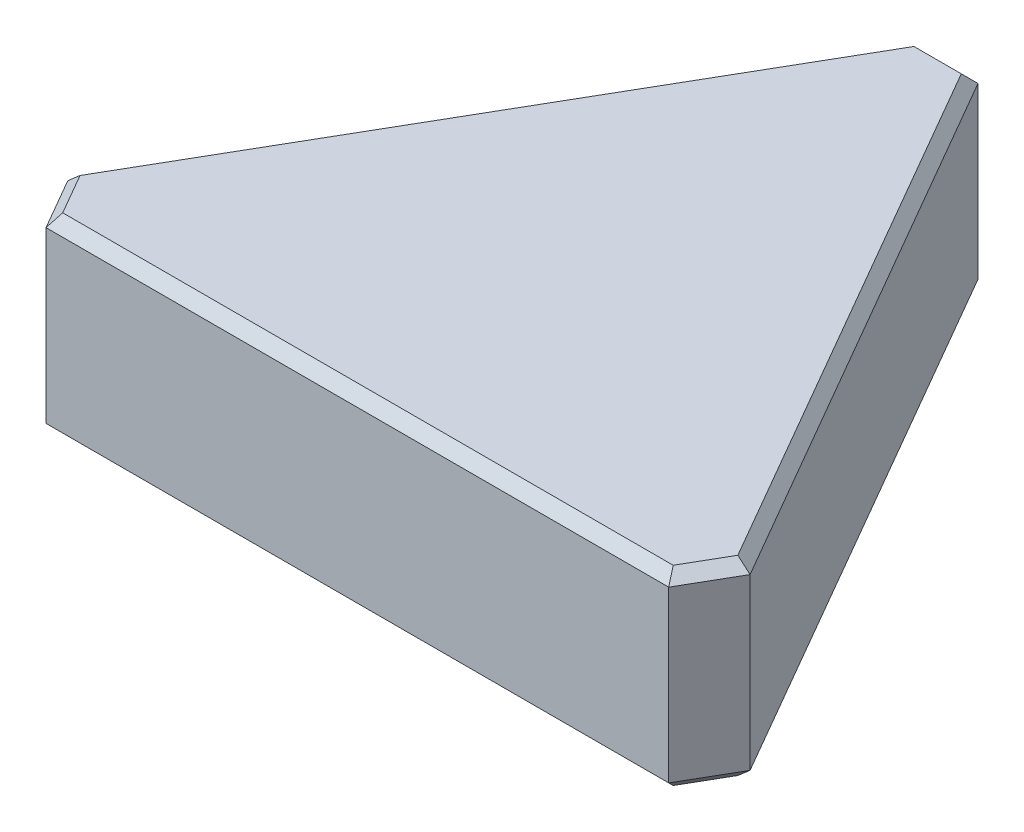
ISO-10303-21;
HEADER;
FILE_DESCRIPTION(('STEP AP214'),'2;1');
FILE_NAME('part.step','',(''),(''),'','','');
FILE_SCHEMA(('AUTOMOTIVE_DESIGN { 1 0 10303 214 1 1 1 1 }'));
ENDSEC;
DATA;
#1=APPLICATION_CONTEXT('core data for automotive mechanical design processes');
#2=APPLICATION_PROTOCOL_DEFINITION('international standard','automotive_design',2000,#1);
#3=PRODUCT_CONTEXT('',#1,'mechanical');
#4=PRODUCT('Part','Part','',(#3));
#5=PRODUCT_RELATED_PRODUCT_CATEGORY('part','',(#4));
#6=PRODUCT_DEFINITION_FORMATION('','',#4);
#7=PRODUCT_DEFINITION_CONTEXT('part definition',#1,'design');
#8=PRODUCT_DEFINITION('design','',#6,#7);
#9=PRODUCT_DEFINITION_SHAPE('','',#8);
#10=(LENGTH_UNIT() NAMED_UNIT(*) SI_UNIT(.MILLI.,.METRE.));
#11=(NAMED_UNIT(*) PLANE_ANGLE_UNIT() SI_UNIT($,.RADIAN.));
#12=(NAMED_UNIT(*) SI_UNIT($,.STERADIAN.) SOLID_ANGLE_UNIT());
#13=UNCERTAINTY_MEASURE_WITH_UNIT(LENGTH_MEASURE(1.E-05),#10,'distance_accuracy_value','');
#14=(GEOMETRIC_REPRESENTATION_CONTEXT(3) GLOBAL_UNCERTAINTY_ASSIGNED_CONTEXT((#13)) GLOBAL_UNIT_ASSIGNED_CONTEXT((#10,
#11,#12)) REPRESENTATION_CONTEXT('',''));
#15=CARTESIAN_POINT('',(0.,0.,0.));
#16=DIRECTION('',(0.,0.,1.));
#17=DIRECTION('',(1.,0.,0.));
#18=AXIS2_PLACEMENT_3D('',#15,#16,#17);
#19=CARTESIAN_POINT('',(70.,36.,0.));
#20=DIRECTION('',(-0.866025403784439,0.,0.5));
#21=DIRECTION('',(0.5,0.,0.866025403784439));
#22=AXIS2_PLACEMENT_3D('',#19,#20,#21);
#23=PLANE('',#22);
#24=DIRECTION('',(0.,-1.,0.));
#25=VECTOR('',#24,1.);
#26=CARTESIAN_POINT('',(64.38,36.,-9.73412553853709));
#27=LINE('',#26,#25);
#28=CARTESIAN_POINT('',(64.38,34.,-9.73412553853709));
#29=VERTEX_POINT('',#28);
#30=CARTESIAN_POINT('',(64.38,1.99999999999999,-9.73412553853709));
#31=VERTEX_POINT('',#30);
#32=EDGE_CURVE('E152',#29,#31,#27,.T.);
#33=ORIENTED_EDGE('',*,*,#32,.T.);
#34=DIRECTION('',(-0.5,0.,-0.866025403784439));
#35=VECTOR('',#34,1.);
#36=CARTESIAN_POINT('',(70.,1.99999999999999,0.));
#37=LINE('',#36,#35);
#38=CARTESIAN_POINT('',(5.62000000000001,1.99999999999999,-111.509430991284));
#39=VERTEX_POINT('',#38);
#40=EDGE_CURVE('E44',#31,#39,#37,.T.);
#41=ORIENTED_EDGE('',*,*,#40,.T.);
#42=DIRECTION('',(0.,1.,0.));
#43=VECTOR('',#42,1.);
#44=CARTESIAN_POINT('',(5.62000000000001,36.,-111.509430991284));
#45=LINE('',#44,#43);
#46=CARTESIAN_POINT('',(5.62000000000001,34.,-111.509430991284));
#47=VERTEX_POINT('',#46);
#48=EDGE_CURVE('E150',#39,#47,#45,.T.);
#49=ORIENTED_EDGE('',*,*,#48,.T.);
#50=DIRECTION('',(0.5,0.,0.866025403784439));
#51=VECTOR('',#50,1.);
#52=CARTESIAN_POINT('',(64.38,34.,-9.7341255385371));
#53=LINE('',#52,#51);
#54=EDGE_CURVE('E169',#47,#29,#53,.T.);
#55=ORIENTED_EDGE('',*,*,#54,.T.);
#56=EDGE_LOOP('',(#33,#41,#49,#55));
#57=FACE_BOUND('',#56,.T.);
#58=ADVANCED_FACE('F35',(#57),#23,.F.);
#59=CARTESIAN_POINT('',(0.,36.,-121.243556529821));
#60=DIRECTION('',(0.866025403784439,0.,0.5));
#61=DIRECTION('',(0.5,0.,-0.866025403784439));
#62=AXIS2_PLACEMENT_3D('',#59,#60,#61);
#63=PLANE('',#62);
#64=DIRECTION('',(0.,-1.,0.));
#65=VECTOR('',#64,1.);
#66=CARTESIAN_POINT('',(-5.62,36.,-111.509430991284));
#67=LINE('',#66,#65);
#68=CARTESIAN_POINT('',(-5.62,34.,-111.509430991284));
#69=VERTEX_POINT('',#68);
#70=CARTESIAN_POINT('',(-5.62,1.99999999999999,-111.509430991284));
#71=VERTEX_POINT('',#70);
#72=EDGE_CURVE('E239',#69,#71,#67,.T.);
#73=ORIENTED_EDGE('',*,*,#72,.T.);
#74=DIRECTION('',(-0.5,0.,0.866025403784439));
#75=VECTOR('',#74,1.);
#76=CARTESIAN_POINT('',(0.,2.,-121.243556529821));
#77=LINE('',#76,#75);
#78=CARTESIAN_POINT('',(-64.38,1.99999999999999,-9.73412553853713));
#79=VERTEX_POINT('',#78);
#80=EDGE_CURVE('E208',#71,#79,#77,.T.);
#81=ORIENTED_EDGE('',*,*,#80,.T.);
#82=DIRECTION('',(0.,1.,0.));
#83=VECTOR('',#82,1.);
#84=CARTESIAN_POINT('',(-64.38,36.,-9.73412553853713));
#85=LINE('',#84,#83);
#86=CARTESIAN_POINT('',(-64.38,34.,-9.73412553853713));
#87=VERTEX_POINT('',#86);
#88=EDGE_CURVE('E238',#79,#87,#85,.T.);
#89=ORIENTED_EDGE('',*,*,#88,.T.);
#90=DIRECTION('',(0.5,0.,-0.866025403784439));
#91=VECTOR('',#90,1.);
#92=CARTESIAN_POINT('',(-5.61999999999999,34.,-111.509430991284));
#93=LINE('',#92,#91);
#94=EDGE_CURVE('E141',#87,#69,#93,.T.);
#95=ORIENTED_EDGE('',*,*,#94,.T.);
#96=EDGE_LOOP('',(#73,#81,#89,#95));
#97=FACE_BOUND('',#96,.T.);
#98=ADVANCED_FACE('F237',(#97),#63,.F.);
#99=CARTESIAN_POINT('',(-70.,36.,0.));
#100=DIRECTION('',(0.,0.,-1.));
#101=DIRECTION('',(-1.,0.,0.));
#102=AXIS2_PLACEMENT_3D('',#99,#100,#101);
#103=PLANE('',#102);
#104=DIRECTION('',(0.,-1.,0.));
#105=VECTOR('',#104,1.);
#106=CARTESIAN_POINT('',(-58.76,36.,0.));
#107=LINE('',#106,#105);
#108=CARTESIAN_POINT('',(-58.76,34.,0.));
#109=VERTEX_POINT('',#108);
#110=CARTESIAN_POINT('',(-58.76,1.99999999999999,0.));
#111=VERTEX_POINT('',#110);
#112=EDGE_CURVE('E245',#109,#111,#107,.T.);
#113=ORIENTED_EDGE('',*,*,#112,.T.);
#114=DIRECTION('',(1.,0.,0.));
#115=VECTOR('',#114,1.);
#116=CARTESIAN_POINT('',(-70.,1.99999999999999,0.));
#117=LINE('',#116,#115);
#118=CARTESIAN_POINT('',(58.76,1.99999999999999,0.));
#119=VERTEX_POINT('',#118);
#120=EDGE_CURVE('E204',#111,#119,#117,.T.);
#121=ORIENTED_EDGE('',*,*,#120,.T.);
#122=DIRECTION('',(0.,1.,0.));
#123=VECTOR('',#122,1.);
#124=CARTESIAN_POINT('',(58.76,36.,0.));
#125=LINE('',#124,#123);
#126=CARTESIAN_POINT('',(58.76,34.,0.));
#127=VERTEX_POINT('',#126);
#128=EDGE_CURVE('E188',#119,#127,#125,.T.);
#129=ORIENTED_EDGE('',*,*,#128,.T.);
#130=DIRECTION('',(-1.,0.,0.));
#131=VECTOR('',#130,1.);
#132=CARTESIAN_POINT('',(-58.76,34.,0.));
#133=LINE('',#132,#131);
#134=EDGE_CURVE('E163',#127,#109,#133,.T.);
#135=ORIENTED_EDGE('',*,*,#134,.T.);
#136=EDGE_LOOP('',(#113,#121,#129,#135));
#137=FACE_BOUND('',#136,.T.);
#138=ADVANCED_FACE('F251',(#137),#103,.F.);
#139=CARTESIAN_POINT('',(0.,36.,0.));
#140=DIRECTION('',(0.,1.,0.));
#141=DIRECTION('',(0.,0.,1.));
#142=AXIS2_PLACEMENT_3D('',#139,#140,#141);
#143=PLANE('',#142);
#144=DIRECTION('',(0.499999999999999,0.,0.866025403784439));
#145=VECTOR('',#144,1.);
#146=CARTESIAN_POINT('',(-42.3379491924311,36.,24.4438263631867));
#147=LINE('',#146,#145);
#148=CARTESIAN_POINT('',(-62.0705989232415,36.,-9.73412553853713));
#149=VERTEX_POINT('',#148);
#150=CARTESIAN_POINT('',(-57.6052994616207,36.,-2.00000000000001));
#151=VERTEX_POINT('',#150);
#152=EDGE_CURVE('E129',#149,#151,#147,.T.);
#153=ORIENTED_EDGE('',*,*,#152,.T.);
#154=DIRECTION('',(1.,0.,0.));
#155=VECTOR('',#154,1.);
#156=CARTESIAN_POINT('',(58.76,36.,-2.00000000000001));
#157=LINE('',#156,#155);
#158=CARTESIAN_POINT('',(57.6052994616208,36.,-2.00000000000001));
#159=VERTEX_POINT('',#158);
#160=EDGE_CURVE('E161',#151,#159,#157,.T.);
#161=ORIENTED_EDGE('',*,*,#160,.T.);
#162=DIRECTION('',(0.499999999999998,0.,-0.86602540378444));
#163=VECTOR('',#162,1.);
#164=CARTESIAN_POINT('',(42.3379491924312,36.,24.4438263631868));
#165=LINE('',#164,#163);
#166=CARTESIAN_POINT('',(62.0705989232415,36.,-9.73412553853709));
#167=VERTEX_POINT('',#166);
#168=EDGE_CURVE('E159',#159,#167,#165,.T.);
#169=ORIENTED_EDGE('',*,*,#168,.T.);
#170=DIRECTION('',(-0.5,0.,-0.866025403784439));
#171=VECTOR('',#170,1.);
#172=CARTESIAN_POINT('',(3.88794919243113,36.,-110.509430991284));
#173=LINE('',#172,#171);
#174=CARTESIAN_POINT('',(4.46529946162075,36.,-109.509430991284));
#175=VERTEX_POINT('',#174);
#176=EDGE_CURVE('E157',#167,#175,#173,.T.);
#177=ORIENTED_EDGE('',*,*,#176,.T.);
#178=DIRECTION('',(-1.,0.,0.));
#179=VECTOR('',#178,1.);
#180=CARTESIAN_POINT('',(1.35208954292842E-13,36.,-109.509430991284));
#181=LINE('',#180,#179);
#182=CARTESIAN_POINT('',(-4.46529946162074,36.,-109.509430991284));
#183=VERTEX_POINT('',#182);
#184=EDGE_CURVE('E132',#175,#183,#181,.T.);
#185=ORIENTED_EDGE('',*,*,#184,.T.);
#186=DIRECTION('',(-0.5,0.,0.866025403784439));
#187=VECTOR('',#186,1.);
#188=CARTESIAN_POINT('',(-62.6479491924311,36.,-8.73412553853711));
#189=LINE('',#188,#187);
#190=EDGE_CURVE('E124',#183,#149,#189,.T.);
#191=ORIENTED_EDGE('',*,*,#190,.T.);
#192=EDGE_LOOP('',(#153,#161,#169,#177,#185,#191));
#193=FACE_BOUND('',#192,.T.);
#194=ADVANCED_FACE('F126',(#193),#143,.T.);
#195=CARTESIAN_POINT('',(0.,0.,0.));
#196=DIRECTION('',(0.,1.,0.));
#197=DIRECTION('',(0.,0.,1.));
#198=AXIS2_PLACEMENT_3D('',#195,#196,#197);
#199=PLANE('',#198);
#200=DIRECTION('',(0.5,0.,0.866025403784439));
#201=VECTOR('',#200,1.);
#202=CARTESIAN_POINT('',(50.7679491924312,0.,-29.3108891324554));
#203=LINE('',#202,#201);
#204=CARTESIAN_POINT('',(4.46529946162077,0.,-109.509430991284));
#205=VERTEX_POINT('',#204);
#206=CARTESIAN_POINT('',(62.0705989232415,0.,-9.7341255385371));
#207=VERTEX_POINT('',#206);
#208=EDGE_CURVE('E190',#205,#207,#203,.T.);
#209=ORIENTED_EDGE('',*,*,#208,.T.);
#210=DIRECTION('',(-0.499999999999998,0.,0.86602540378444));
#211=VECTOR('',#210,1.);
#212=CARTESIAN_POINT('',(57.0279491924312,0.,-0.999999999999983));
#213=LINE('',#212,#211);
#214=CARTESIAN_POINT('',(57.6052994616208,0.,-1.99999999999996));
#215=VERTEX_POINT('',#214);
#216=EDGE_CURVE('E198',#207,#215,#213,.T.);
#217=ORIENTED_EDGE('',*,*,#216,.T.);
#218=DIRECTION('',(-1.,0.,0.));
#219=VECTOR('',#218,1.);
#220=CARTESIAN_POINT('',(0.,0.,-1.99999999999996));
#221=LINE('',#220,#219);
#222=CARTESIAN_POINT('',(-57.6052994616207,0.,-1.99999999999996));
#223=VERTEX_POINT('',#222);
#224=EDGE_CURVE('E196',#215,#223,#221,.T.);
#225=ORIENTED_EDGE('',*,*,#224,.T.);
#226=DIRECTION('',(-0.499999999999999,0.,-0.866025403784439));
#227=VECTOR('',#226,1.);
#228=CARTESIAN_POINT('',(-62.6479491924311,0.,-10.7341255385371));
#229=LINE('',#228,#227);
#230=CARTESIAN_POINT('',(-62.0705989232415,0.,-9.73412553853714));
#231=VERTEX_POINT('',#230);
#232=EDGE_CURVE('E194',#223,#231,#229,.T.);
#233=ORIENTED_EDGE('',*,*,#232,.T.);
#234=DIRECTION('',(0.5,0.,-0.866025403784439));
#235=VECTOR('',#234,1.);
#236=CARTESIAN_POINT('',(-50.7679491924312,0.,-29.3108891324554));
#237=LINE('',#236,#235);
#238=CARTESIAN_POINT('',(-4.46529946162076,0.,-109.509430991284));
#239=VERTEX_POINT('',#238);
#240=EDGE_CURVE('E192',#231,#239,#237,.T.);
#241=ORIENTED_EDGE('',*,*,#240,.T.);
#242=DIRECTION('',(1.,0.,0.));
#243=VECTOR('',#242,1.);
#244=CARTESIAN_POINT('',(5.61999999999998,0.,-109.509430991284));
#245=LINE('',#244,#243);
#246=EDGE_CURVE('E178',#239,#205,#245,.T.);
#247=ORIENTED_EDGE('',*,*,#246,.T.);
#248=EDGE_LOOP('',(#209,#217,#225,#233,#241,#247));
#249=FACE_BOUND('',#248,.T.);
#250=ADVANCED_FACE('F285',(#249),#199,.F.);
#251=CARTESIAN_POINT('',(-58.76,36.,0.));
#252=DIRECTION('',(0.866025403784439,0.,-0.499999999999999));
#253=DIRECTION('',(0.,-1.,0.));
#254=AXIS2_PLACEMENT_3D('',#251,#252,#253);
#255=PLANE('',#254);
#256=ORIENTED_EDGE('',*,*,#88,.F.);
#257=DIRECTION('',(-0.499999999999999,0.,-0.866025403784439));
#258=VECTOR('',#257,1.);
#259=CARTESIAN_POINT('',(-58.76,1.99999999999999,0.));
#260=LINE('',#259,#258);
#261=EDGE_CURVE('E206',#79,#111,#260,.F.);
#262=ORIENTED_EDGE('',*,*,#261,.T.);
#263=ORIENTED_EDGE('',*,*,#112,.F.);
#264=DIRECTION('',(0.499999999999999,0.,0.866025403784439));
#265=VECTOR('',#264,1.);
#266=CARTESIAN_POINT('',(-58.76,34.,0.));
#267=LINE('',#266,#265);
#268=EDGE_CURVE('E175',#109,#87,#267,.F.);
#269=ORIENTED_EDGE('',*,*,#268,.T.);
#270=EDGE_LOOP('',(#256,#262,#263,#269));
#271=FACE_BOUND('',#270,.T.);
#272=ADVANCED_FACE('F241',(#271),#255,.F.);
#273=CARTESIAN_POINT('',(-5.62,36.,-111.509430991284));
#274=DIRECTION('',(0.,0.,1.));
#275=DIRECTION('',(0.,-1.,0.));
#276=AXIS2_PLACEMENT_3D('',#273,#274,#275);
#277=PLANE('',#276);
#278=ORIENTED_EDGE('',*,*,#48,.F.);
#279=DIRECTION('',(1.,0.,0.));
#280=VECTOR('',#279,1.);
#281=CARTESIAN_POINT('',(-5.62,1.99999999999999,-111.509430991284));
#282=LINE('',#281,#280);
#283=EDGE_CURVE('E11',#39,#71,#282,.F.);
#284=ORIENTED_EDGE('',*,*,#283,.T.);
#285=ORIENTED_EDGE('',*,*,#72,.F.);
#286=DIRECTION('',(-1.,0.,0.));
#287=VECTOR('',#286,1.);
#288=CARTESIAN_POINT('',(-5.62,34.,-111.509430991284));
#289=LINE('',#288,#287);
#290=EDGE_CURVE('E171',#69,#47,#289,.F.);
#291=ORIENTED_EDGE('',*,*,#290,.T.);
#292=EDGE_LOOP('',(#278,#284,#285,#291));
#293=FACE_BOUND('',#292,.T.);
#294=ADVANCED_FACE('F274',(#293),#277,.F.);
#295=CARTESIAN_POINT('',(64.38,36.,-9.73412553853709));
#296=DIRECTION('',(-0.86602540378444,0.,-0.499999999999998));
#297=DIRECTION('',(0.,-1.,0.));
#298=AXIS2_PLACEMENT_3D('',#295,#296,#297);
#299=PLANE('',#298);
#300=ORIENTED_EDGE('',*,*,#128,.F.);
#301=DIRECTION('',(-0.499999999999998,0.,0.86602540378444));
#302=VECTOR('',#301,1.);
#303=CARTESIAN_POINT('',(64.38,1.99999999999999,-9.73412553853709));
#304=LINE('',#303,#302);
#305=EDGE_CURVE('E201',#119,#31,#304,.F.);
#306=ORIENTED_EDGE('',*,*,#305,.T.);
#307=ORIENTED_EDGE('',*,*,#32,.F.);
#308=DIRECTION('',(0.499999999999998,0.,-0.86602540378444));
#309=VECTOR('',#308,1.);
#310=CARTESIAN_POINT('',(64.38,34.,-9.73412553853709));
#311=LINE('',#310,#309);
#312=EDGE_CURVE('E166',#29,#127,#311,.F.);
#313=ORIENTED_EDGE('',*,*,#312,.T.);
#314=EDGE_LOOP('',(#300,#306,#307,#313));
#315=FACE_BOUND('',#314,.T.);
#316=ADVANCED_FACE('F258',(#315),#299,.F.);
#317=CARTESIAN_POINT('',(1.35208954292842E-13,36.,-109.509430991284));
#318=DIRECTION('',(0.,0.707106781186544,-0.707106781186551));
#319=DIRECTION('',(1.,0.,0.));
#320=AXIS2_PLACEMENT_3D('',#317,#318,#319);
#321=PLANE('',#320);
#322=DIRECTION('',(0.377964473009229,-0.65465367070798,-0.654653670707973));
#323=VECTOR('',#322,1.);
#324=CARTESIAN_POINT('',(3.8273995385321,37.1048750769338,-108.404555914351));
#325=LINE('',#324,#323);
#326=EDGE_CURVE('E144',#47,#175,#325,.F.);
#327=ORIENTED_EDGE('',*,*,#326,.F.);
#328=ORIENTED_EDGE('',*,*,#290,.F.);
#329=DIRECTION('',(-0.37796447300923,-0.65465367070798,-0.654653670707973));
#330=VECTOR('',#329,1.);
#331=CARTESIAN_POINT('',(8.76402903289644,58.9138691025224,-86.5955618887622));
#332=LINE('',#331,#330);
#333=EDGE_CURVE('E186',#183,#69,#332,.T.);
#334=ORIENTED_EDGE('',*,*,#333,.F.);
#335=ORIENTED_EDGE('',*,*,#184,.F.);
#336=EDGE_LOOP('',(#327,#328,#334,#335));
#337=FACE_BOUND('',#336,.T.);
#338=ADVANCED_FACE('F273',(#337),#321,.T.);
#339=CARTESIAN_POINT('',(-50.7679491924311,36.,-29.3108891324553));
#340=DIRECTION('',(-0.612372435695796,0.707106781186546,-0.353553390593274));
#341=DIRECTION('',(0.5,0.,-0.866025403784439));
#342=AXIS2_PLACEMENT_3D('',#339,#340,#341);
#343=PLANE('',#342);
#344=ORIENTED_EDGE('',*,*,#333,.T.);
#345=ORIENTED_EDGE('',*,*,#94,.F.);
#346=DIRECTION('',(-0.755928946018454,-0.654653670707978,0.));
#347=VECTOR('',#346,1.);
#348=CARTESIAN_POINT('',(-50.7947990770642,45.7651291147782,-9.73412553853719));
#349=LINE('',#348,#347);
#350=EDGE_CURVE('E139',#149,#87,#349,.T.);
#351=ORIENTED_EDGE('',*,*,#350,.F.);
#352=ORIENTED_EDGE('',*,*,#190,.F.);
#353=EDGE_LOOP('',(#344,#345,#351,#352));
#354=FACE_BOUND('',#353,.T.);
#355=ADVANCED_FACE('F140',(#354),#343,.T.);
#356=CARTESIAN_POINT('',(50.7679491924311,36.,-29.3108891324553));
#357=DIRECTION('',(0.612372435695796,0.707106781186545,-0.353553390593275));
#358=DIRECTION('',(0.5,0.,0.866025403784439));
#359=AXIS2_PLACEMENT_3D('',#356,#357,#358);
#360=PLANE('',#359);
#361=ORIENTED_EDGE('',*,*,#326,.T.);
#362=ORIENTED_EDGE('',*,*,#176,.F.);
#363=DIRECTION('',(0.755928946018453,-0.654653670707979,0.));
#364=VECTOR('',#363,1.);
#365=CARTESIAN_POINT('',(55.611941934207,41.5933610268338,-9.73412553853711));
#366=LINE('',#365,#364);
#367=EDGE_CURVE('E145',#29,#167,#366,.F.);
#368=ORIENTED_EDGE('',*,*,#367,.F.);
#369=ORIENTED_EDGE('',*,*,#54,.F.);
#370=EDGE_LOOP('',(#361,#362,#368,#369));
#371=FACE_BOUND('',#370,.T.);
#372=ADVANCED_FACE('F268',(#371),#360,.T.);
#373=CARTESIAN_POINT('',(-42.3379491924311,36.,24.4438263631868));
#374=DIRECTION('',(-0.612372435695794,0.707106781186548,0.353553390593273));
#375=DIRECTION('',(-0.499999999999999,0.,-0.866025403784439));
#376=AXIS2_PLACEMENT_3D('',#373,#374,#375);
#377=PLANE('',#376);
#378=ORIENTED_EDGE('',*,*,#350,.T.);
#379=ORIENTED_EDGE('',*,*,#268,.F.);
#380=DIRECTION('',(0.377964473009231,0.654653670707978,-0.654653670707974));
#381=VECTOR('',#380,1.);
#382=CARTESIAN_POINT('',(-61.967399538532,28.4446210390896,5.55537896091039));
#383=LINE('',#382,#381);
#384=EDGE_CURVE('E148',#151,#109,#383,.F.);
#385=ORIENTED_EDGE('',*,*,#384,.F.);
#386=ORIENTED_EDGE('',*,*,#152,.F.);
#387=EDGE_LOOP('',(#378,#379,#385,#386));
#388=FACE_BOUND('',#387,.T.);
#389=ADVANCED_FACE('F147',(#388),#377,.T.);
#390=CARTESIAN_POINT('',(42.3379491924312,36.,24.4438263631868));
#391=DIRECTION('',(0.612372435695796,0.707106781186547,0.353553390593273));
#392=DIRECTION('',(-0.499999999999998,0.,0.86602540378444));
#393=AXIS2_PLACEMENT_3D('',#390,#391,#392);
#394=PLANE('',#393);
#395=ORIENTED_EDGE('',*,*,#367,.T.);
#396=ORIENTED_EDGE('',*,*,#168,.F.);
#397=DIRECTION('',(0.377964473009229,-0.654653670707978,0.654653670707975));
#398=VECTOR('',#397,1.);
#399=CARTESIAN_POINT('',(61.9673995385321,28.4446210390895,5.55537896091043));
#400=LINE('',#399,#398);
#401=EDGE_CURVE('E179',#127,#159,#400,.F.);
#402=ORIENTED_EDGE('',*,*,#401,.F.);
#403=ORIENTED_EDGE('',*,*,#312,.F.);
#404=EDGE_LOOP('',(#395,#396,#402,#403));
#405=FACE_BOUND('',#404,.T.);
#406=ADVANCED_FACE('F265',(#405),#394,.T.);
#407=CARTESIAN_POINT('',(0.,36.,-2.00000000000001));
#408=DIRECTION('',(0.,0.707106781186546,0.707106781186549));
#409=DIRECTION('',(-1.,0.,0.));
#410=AXIS2_PLACEMENT_3D('',#407,#408,#409);
#411=PLANE('',#410);
#412=ORIENTED_EDGE('',*,*,#384,.T.);
#413=ORIENTED_EDGE('',*,*,#134,.F.);
#414=ORIENTED_EDGE('',*,*,#401,.T.);
#415=ORIENTED_EDGE('',*,*,#160,.F.);
#416=EDGE_LOOP('',(#412,#413,#414,#415));
#417=FACE_BOUND('',#416,.T.);
#418=ADVANCED_FACE('F263',(#417),#411,.T.);
#419=CARTESIAN_POINT('',(0.,1.99999999999999,-121.243556529821));
#420=DIRECTION('',(0.6123724356958,0.707106781186541,0.353553390593277));
#421=DIRECTION('',(-0.5,0.,0.866025403784439));
#422=AXIS2_PLACEMENT_3D('',#419,#420,#421);
#423=PLANE('',#422);
#424=DIRECTION('',(-0.75592894601845,0.654653670707983,0.));
#425=VECTOR('',#424,1.);
#426=CARTESIAN_POINT('',(-27.5914285714288,-29.8598374260815,-9.73412553853728));
#427=LINE('',#426,#425);
#428=EDGE_CURVE('E220',#79,#231,#427,.F.);
#429=ORIENTED_EDGE('',*,*,#428,.F.);
#430=ORIENTED_EDGE('',*,*,#80,.F.);
#431=DIRECTION('',(-0.377964473009227,0.654653670707985,-0.654653670707969));
#432=VECTOR('',#431,1.);
#433=CARTESIAN_POINT('',(-3.82739953853206,-1.10487507693392,-108.404555914351));
#434=LINE('',#433,#432);
#435=EDGE_CURVE('E39',#239,#71,#434,.T.);
#436=ORIENTED_EDGE('',*,*,#435,.F.);
#437=ORIENTED_EDGE('',*,*,#240,.F.);
#438=EDGE_LOOP('',(#429,#430,#436,#437));
#439=FACE_BOUND('',#438,.T.);
#440=ADVANCED_FACE('F37',(#439),#423,.F.);
#441=CARTESIAN_POINT('',(1.35208954292842E-13,0.,-109.509430991284));
#442=DIRECTION('',(0.,0.707106781186539,0.707106781186556));
#443=DIRECTION('',(1.,0.,0.));
#444=AXIS2_PLACEMENT_3D('',#441,#442,#443);
#445=PLANE('',#444);
#446=ORIENTED_EDGE('',*,*,#435,.T.);
#447=ORIENTED_EDGE('',*,*,#283,.F.);
#448=DIRECTION('',(-0.377964473009231,-0.654653670707984,0.654653670707968));
#449=VECTOR('',#448,1.);
#450=CARTESIAN_POINT('',(3.8273995385321,-1.10487507693386,-108.404555914351));
#451=LINE('',#450,#449);
#452=EDGE_CURVE('E218',#205,#39,#451,.F.);
#453=ORIENTED_EDGE('',*,*,#452,.F.);
#454=ORIENTED_EDGE('',*,*,#246,.F.);
#455=EDGE_LOOP('',(#446,#447,#453,#454));
#456=FACE_BOUND('',#455,.T.);
#457=ADVANCED_FACE('F230',(#456),#445,.F.);
#458=CARTESIAN_POINT('',(-42.3379491924312,0.,24.4438263631868));
#459=DIRECTION('',(0.612372435695799,0.707106781186543,-0.353553390593275));
#460=DIRECTION('',(-0.499999999999999,0.,-0.866025403784439));
#461=AXIS2_PLACEMENT_3D('',#458,#459,#460);
#462=PLANE('',#461);
#463=ORIENTED_EDGE('',*,*,#428,.T.);
#464=ORIENTED_EDGE('',*,*,#232,.F.);
#465=DIRECTION('',(-0.377964473009226,0.654653670707982,0.654653670707973));
#466=VECTOR('',#465,1.);
#467=CARTESIAN_POINT('',(-61.967399538532,7.5553789609105,5.55537896091043));
#468=LINE('',#467,#466);
#469=EDGE_CURVE('E215',#111,#223,#468,.F.);
#470=ORIENTED_EDGE('',*,*,#469,.F.);
#471=ORIENTED_EDGE('',*,*,#261,.F.);
#472=EDGE_LOOP('',(#463,#464,#470,#471));
#473=FACE_BOUND('',#472,.T.);
#474=ADVANCED_FACE('F313',(#473),#462,.F.);
#475=CARTESIAN_POINT('',(70.,1.99999999999999,0.));
#476=DIRECTION('',(-0.612372435695799,0.707106781186543,0.353553390593276));
#477=DIRECTION('',(-0.5,0.,-0.866025403784439));
#478=AXIS2_PLACEMENT_3D('',#475,#476,#477);
#479=PLANE('',#478);
#480=ORIENTED_EDGE('',*,*,#452,.T.);
#481=ORIENTED_EDGE('',*,*,#40,.F.);
#482=DIRECTION('',(-0.75592894601845,-0.654653670707982,0.));
#483=VECTOR('',#482,1.);
#484=CARTESIAN_POINT('',(67.5914285714286,4.78117872529631,-9.73412553853709));
#485=LINE('',#484,#483);
#486=EDGE_CURVE('E213',#207,#31,#485,.F.);
#487=ORIENTED_EDGE('',*,*,#486,.F.);
#488=ORIENTED_EDGE('',*,*,#208,.F.);
#489=EDGE_LOOP('',(#480,#481,#487,#488));
#490=FACE_BOUND('',#489,.T.);
#491=ADVANCED_FACE('F309',(#490),#479,.F.);
#492=CARTESIAN_POINT('',(-70.,1.99999999999999,0.));
#493=DIRECTION('',(0.,0.707106781186543,-0.707106781186552));
#494=DIRECTION('',(1.,0.,0.));
#495=AXIS2_PLACEMENT_3D('',#492,#493,#494);
#496=PLANE('',#495);
#497=ORIENTED_EDGE('',*,*,#469,.T.);
#498=ORIENTED_EDGE('',*,*,#224,.F.);
#499=DIRECTION('',(0.377964473009228,0.654653670707981,0.654653670707972));
#500=VECTOR('',#499,1.);
#501=CARTESIAN_POINT('',(40.3657142857142,-29.8598374260815,-31.8598374260811));
#502=LINE('',#501,#500);
#503=EDGE_CURVE('E211',#119,#215,#502,.F.);
#504=ORIENTED_EDGE('',*,*,#503,.F.);
#505=ORIENTED_EDGE('',*,*,#120,.F.);
#506=EDGE_LOOP('',(#497,#498,#504,#505));
#507=FACE_BOUND('',#506,.T.);
#508=ADVANCED_FACE('F305',(#507),#496,.F.);
#509=CARTESIAN_POINT('',(42.3379491924313,0.,24.4438263631868));
#510=DIRECTION('',(-0.612372435695798,0.707106781186544,-0.353553390593274));
#511=DIRECTION('',(-0.499999999999998,0.,0.86602540378444));
#512=AXIS2_PLACEMENT_3D('',#509,#510,#511);
#513=PLANE('',#512);
#514=ORIENTED_EDGE('',*,*,#486,.T.);
#515=ORIENTED_EDGE('',*,*,#305,.F.);
#516=ORIENTED_EDGE('',*,*,#503,.T.);
#517=ORIENTED_EDGE('',*,*,#216,.F.);
#518=EDGE_LOOP('',(#514,#515,#516,#517));
#519=FACE_BOUND('',#518,.T.);
#520=ADVANCED_FACE('F302',(#519),#513,.F.);
#521=CLOSED_SHELL('',(#58,#98,#138,#194,#250,#272,#294,#316,#338,#355,#372,#389,#406,#418,#440,
#457,#474,#491,#508,#520));
#522=MANIFOLD_SOLID_BREP('B2',#521);
#523=ADVANCED_BREP_SHAPE_REPRESENTATION('',(#18,#522),#14);
#524=SHAPE_DEFINITION_REPRESENTATION(#9,#523);
ENDSEC;
END-ISO-10303-21;
